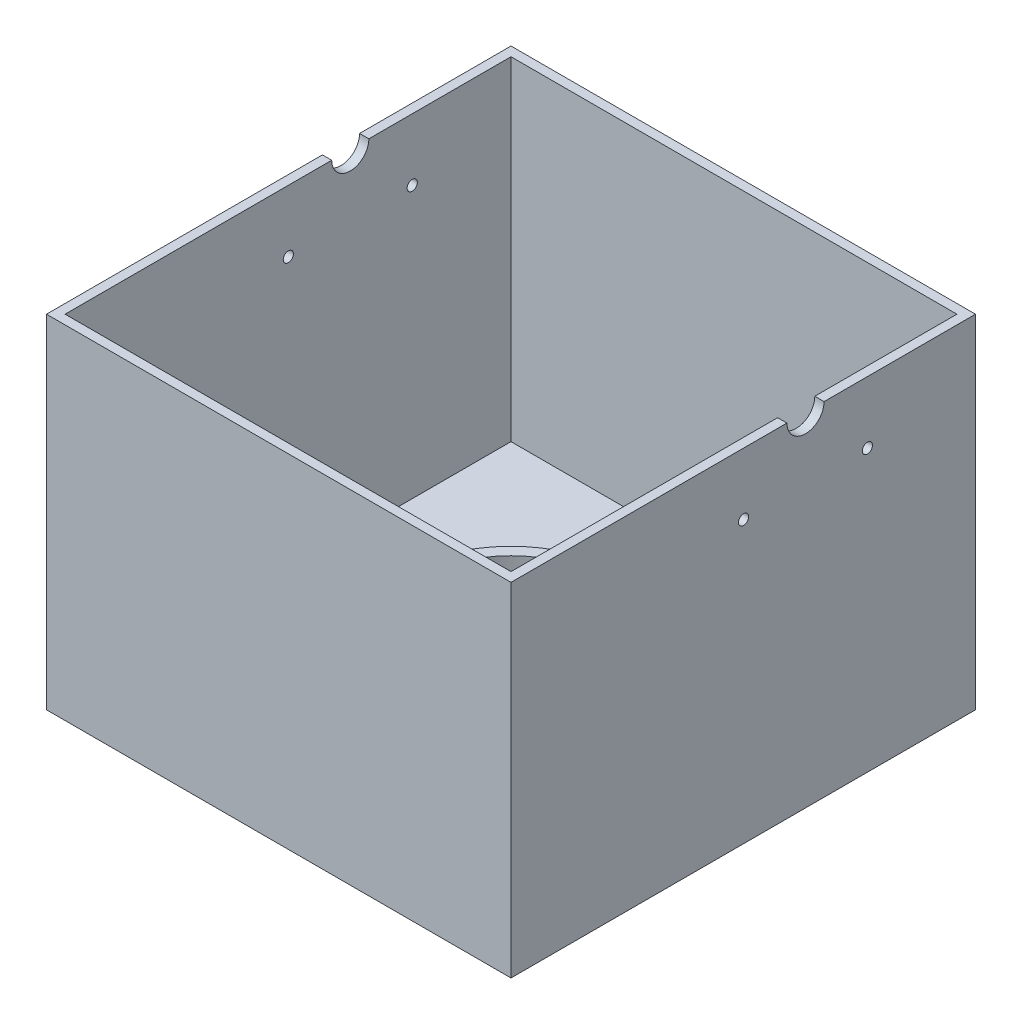
ISO-10303-21;
HEADER;
FILE_DESCRIPTION(('STEP AP214'),'2;1');
FILE_NAME('part.step','',(''),(''),'','','');
FILE_SCHEMA(('AUTOMOTIVE_DESIGN { 1 0 10303 214 1 1 1 1 }'));
ENDSEC;
DATA;
#1=APPLICATION_CONTEXT('core data for automotive mechanical design processes');
#2=APPLICATION_PROTOCOL_DEFINITION('international standard','automotive_design',2000,#1);
#3=PRODUCT_CONTEXT('',#1,'mechanical');
#4=PRODUCT('Part','Part','',(#3));
#5=PRODUCT_RELATED_PRODUCT_CATEGORY('part','',(#4));
#6=PRODUCT_DEFINITION_FORMATION('','',#4);
#7=PRODUCT_DEFINITION_CONTEXT('part definition',#1,'design');
#8=PRODUCT_DEFINITION('design','',#6,#7);
#9=PRODUCT_DEFINITION_SHAPE('','',#8);
#10=(LENGTH_UNIT() NAMED_UNIT(*) SI_UNIT(.MILLI.,.METRE.));
#11=(NAMED_UNIT(*) PLANE_ANGLE_UNIT() SI_UNIT($,.RADIAN.));
#12=(NAMED_UNIT(*) SI_UNIT($,.STERADIAN.) SOLID_ANGLE_UNIT());
#13=UNCERTAINTY_MEASURE_WITH_UNIT(LENGTH_MEASURE(1.E-05),#10,'distance_accuracy_value','');
#14=(GEOMETRIC_REPRESENTATION_CONTEXT(3) GLOBAL_UNCERTAINTY_ASSIGNED_CONTEXT((#13)) GLOBAL_UNIT_ASSIGNED_CONTEXT((#10,
#11,#12)) REPRESENTATION_CONTEXT('',''));
#15=CARTESIAN_POINT('',(0.,0.,0.));
#16=DIRECTION('',(0.,0.,1.));
#17=DIRECTION('',(1.,0.,0.));
#18=AXIS2_PLACEMENT_3D('',#15,#16,#17);
#19=CARTESIAN_POINT('',(0.,91.,0.));
#20=DIRECTION('',(0.,-1.,0.));
#21=DIRECTION('',(0.,0.,-1.));
#22=AXIS2_PLACEMENT_3D('',#19,#20,#21);
#23=CYLINDRICAL_SURFACE('',#22,31.25);
#24=CARTESIAN_POINT('',(0.,21.,0.));
#25=DIRECTION('',(0.,1.,0.));
#26=DIRECTION('',(0.,0.,1.));
#27=AXIS2_PLACEMENT_3D('',#24,#25,#26);
#28=CIRCLE('',#27,31.25);
#29=CARTESIAN_POINT('',(0.,21.,31.25));
#30=VERTEX_POINT('',#29);
#31=EDGE_CURVE('E246',#30,#30,#28,.T.);
#32=ORIENTED_EDGE('',*,*,#31,.T.);
#33=EDGE_LOOP('',(#32));
#34=FACE_BOUND('',#33,.T.);
#35=CARTESIAN_POINT('',(0.,-24.,0.));
#36=DIRECTION('',(0.,-1.,0.));
#37=DIRECTION('',(0.,0.,-1.));
#38=AXIS2_PLACEMENT_3D('',#35,#36,#37);
#39=CIRCLE('',#38,31.25);
#40=CARTESIAN_POINT('',(0.,-24.,-31.25));
#41=VERTEX_POINT('',#40);
#42=EDGE_CURVE('E11',#41,#41,#39,.F.);
#43=ORIENTED_EDGE('',*,*,#42,.F.);
#44=EDGE_LOOP('',(#43));
#45=FACE_BOUND('',#44,.T.);
#46=ADVANCED_FACE('F36',(#34,#45),#23,.F.);
#47=CARTESIAN_POINT('',(0.,0.,0.));
#48=DIRECTION('',(0.,1.,0.));
#49=DIRECTION('',(0.,0.,1.));
#50=AXIS2_PLACEMENT_3D('',#47,#48,#49);
#51=PLANE('',#50);
#52=DIRECTION('',(0.,0.,-1.));
#53=VECTOR('',#52,1.);
#54=CARTESIAN_POINT('',(75.,0.,-75.));
#55=LINE('',#54,#53);
#56=CARTESIAN_POINT('',(75.,0.,75.));
#57=VERTEX_POINT('',#56);
#58=CARTESIAN_POINT('',(75.,0.,-75.));
#59=VERTEX_POINT('',#58);
#60=EDGE_CURVE('E149',#57,#59,#55,.T.);
#61=ORIENTED_EDGE('',*,*,#60,.F.);
#62=DIRECTION('',(1.,0.,0.));
#63=VECTOR('',#62,1.);
#64=CARTESIAN_POINT('',(-75.,0.,75.));
#65=LINE('',#64,#63);
#66=CARTESIAN_POINT('',(-75.,0.,75.));
#67=VERTEX_POINT('',#66);
#68=EDGE_CURVE('E160',#67,#57,#65,.T.);
#69=ORIENTED_EDGE('',*,*,#68,.F.);
#70=DIRECTION('',(0.,0.,1.));
#71=VECTOR('',#70,1.);
#72=CARTESIAN_POINT('',(-75.,0.,-75.));
#73=LINE('',#72,#71);
#74=CARTESIAN_POINT('',(-75.,0.,-75.));
#75=VERTEX_POINT('',#74);
#76=EDGE_CURVE('E158',#75,#67,#73,.T.);
#77=ORIENTED_EDGE('',*,*,#76,.F.);
#78=DIRECTION('',(-1.,0.,0.));
#79=VECTOR('',#78,1.);
#80=CARTESIAN_POINT('',(-75.,0.,-75.));
#81=LINE('',#80,#79);
#82=EDGE_CURVE('E156',#59,#75,#81,.T.);
#83=ORIENTED_EDGE('',*,*,#82,.F.);
#84=EDGE_LOOP('',(#61,#69,#77,#83));
#85=FACE_BOUND('',#84,.T.);
#86=CARTESIAN_POINT('',(0.,0.,0.));
#87=DIRECTION('',(0.,1.,0.));
#88=DIRECTION('',(0.,0.,1.));
#89=AXIS2_PLACEMENT_3D('',#86,#87,#88);
#90=CIRCLE('',#89,35.);
#91=CARTESIAN_POINT('',(0.,0.,35.));
#92=VERTEX_POINT('',#91);
#93=EDGE_CURVE('E44',#92,#92,#90,.F.);
#94=ORIENTED_EDGE('',*,*,#93,.F.);
#95=EDGE_LOOP('',(#94));
#96=FACE_BOUND('',#95,.T.);
#97=ADVANCED_FACE('F187',(#85,#96),#51,.F.);
#98=CARTESIAN_POINT('',(0.,3.,0.));
#99=DIRECTION('',(0.,1.,0.));
#100=DIRECTION('',(0.,0.,1.));
#101=AXIS2_PLACEMENT_3D('',#98,#99,#100);
#102=PLANE('',#101);
#103=DIRECTION('',(0.,0.,1.));
#104=VECTOR('',#103,1.);
#105=CARTESIAN_POINT('',(-72.,3.,72.));
#106=LINE('',#105,#104);
#107=CARTESIAN_POINT('',(-72.,3.,-72.));
#108=VERTEX_POINT('',#107);
#109=CARTESIAN_POINT('',(-72.,3.,72.));
#110=VERTEX_POINT('',#109);
#111=EDGE_CURVE('E237',#108,#110,#106,.T.);
#112=ORIENTED_EDGE('',*,*,#111,.T.);
#113=DIRECTION('',(1.,0.,0.));
#114=VECTOR('',#113,1.);
#115=CARTESIAN_POINT('',(72.,3.,72.));
#116=LINE('',#115,#114);
#117=CARTESIAN_POINT('',(72.,3.,72.));
#118=VERTEX_POINT('',#117);
#119=EDGE_CURVE('E238',#110,#118,#116,.T.);
#120=ORIENTED_EDGE('',*,*,#119,.T.);
#121=DIRECTION('',(0.,0.,-1.));
#122=VECTOR('',#121,1.);
#123=CARTESIAN_POINT('',(72.,3.,72.));
#124=LINE('',#123,#122);
#125=CARTESIAN_POINT('',(72.,3.,-72.));
#126=VERTEX_POINT('',#125);
#127=EDGE_CURVE('E467',#118,#126,#124,.T.);
#128=ORIENTED_EDGE('',*,*,#127,.T.);
#129=DIRECTION('',(-1.,0.,0.));
#130=VECTOR('',#129,1.);
#131=CARTESIAN_POINT('',(72.,3.,-72.));
#132=LINE('',#131,#130);
#133=EDGE_CURVE('E465',#126,#108,#132,.T.);
#134=ORIENTED_EDGE('',*,*,#133,.T.);
#135=EDGE_LOOP('',(#112,#120,#128,#134));
#136=FACE_BOUND('',#135,.T.);
#137=CARTESIAN_POINT('',(0.,3.,0.));
#138=DIRECTION('',(0.,1.,0.));
#139=DIRECTION('',(0.,0.,1.));
#140=AXIS2_PLACEMENT_3D('',#137,#138,#139);
#141=CIRCLE('',#140,35.);
#142=CARTESIAN_POINT('',(0.,3.,35.));
#143=VERTEX_POINT('',#142);
#144=EDGE_CURVE('E243',#143,#143,#141,.T.);
#145=ORIENTED_EDGE('',*,*,#144,.F.);
#146=EDGE_LOOP('',(#145));
#147=FACE_BOUND('',#146,.T.);
#148=ADVANCED_FACE('F189',(#136,#147),#102,.T.);
#149=CARTESIAN_POINT('',(0.,110.65,0.));
#150=DIRECTION('',(0.,1.,0.));
#151=DIRECTION('',(0.,0.,1.));
#152=AXIS2_PLACEMENT_3D('',#149,#150,#151);
#153=PLANE('',#152);
#154=DIRECTION('',(-1.,0.,0.));
#155=VECTOR('',#154,1.);
#156=CARTESIAN_POINT('',(75.,110.65,-26.1));
#157=LINE('',#156,#155);
#158=CARTESIAN_POINT('',(75.,110.65,-26.1));
#159=VERTEX_POINT('',#158);
#160=CARTESIAN_POINT('',(72.,110.65,-26.1));
#161=VERTEX_POINT('',#160);
#162=EDGE_CURVE('E59',#159,#161,#157,.T.);
#163=ORIENTED_EDGE('',*,*,#162,.F.);
#164=DIRECTION('',(0.,0.,-1.));
#165=VECTOR('',#164,1.);
#166=CARTESIAN_POINT('',(75.,110.65,75.));
#167=LINE('',#166,#165);
#168=CARTESIAN_POINT('',(75.,110.65,-75.));
#169=VERTEX_POINT('',#168);
#170=EDGE_CURVE('E139',#159,#169,#167,.T.);
#171=ORIENTED_EDGE('',*,*,#170,.T.);
#172=DIRECTION('',(-1.,0.,0.));
#173=VECTOR('',#172,1.);
#174=CARTESIAN_POINT('',(75.,110.65,-75.));
#175=LINE('',#174,#173);
#176=CARTESIAN_POINT('',(-75.,110.65,-75.));
#177=VERTEX_POINT('',#176);
#178=EDGE_CURVE('E146',#169,#177,#175,.T.);
#179=ORIENTED_EDGE('',*,*,#178,.T.);
#180=DIRECTION('',(0.,0.,1.));
#181=VECTOR('',#180,1.);
#182=CARTESIAN_POINT('',(-75.,110.65,75.));
#183=LINE('',#182,#181);
#184=CARTESIAN_POINT('',(-75.,110.65,-26.1));
#185=VERTEX_POINT('',#184);
#186=EDGE_CURVE('E226',#177,#185,#183,.T.);
#187=ORIENTED_EDGE('',*,*,#186,.T.);
#188=CARTESIAN_POINT('',(-72.,110.65,-26.1));
#189=VERTEX_POINT('',#188);
#190=EDGE_CURVE('E235',#189,#185,#157,.T.);
#191=ORIENTED_EDGE('',*,*,#190,.F.);
#192=DIRECTION('',(0.,0.,1.));
#193=VECTOR('',#192,1.);
#194=CARTESIAN_POINT('',(-72.,110.65,72.));
#195=LINE('',#194,#193);
#196=CARTESIAN_POINT('',(-72.,110.65,-72.));
#197=VERTEX_POINT('',#196);
#198=EDGE_CURVE('E462',#197,#189,#195,.T.);
#199=ORIENTED_EDGE('',*,*,#198,.F.);
#200=DIRECTION('',(-1.,0.,0.));
#201=VECTOR('',#200,1.);
#202=CARTESIAN_POINT('',(72.,110.65,-72.));
#203=LINE('',#202,#201);
#204=CARTESIAN_POINT('',(72.,110.65,-72.));
#205=VERTEX_POINT('',#204);
#206=EDGE_CURVE('E473',#205,#197,#203,.T.);
#207=ORIENTED_EDGE('',*,*,#206,.F.);
#208=DIRECTION('',(0.,0.,-1.));
#209=VECTOR('',#208,1.);
#210=CARTESIAN_POINT('',(72.,110.65,72.));
#211=LINE('',#210,#209);
#212=EDGE_CURVE('E232',#161,#205,#211,.T.);
#213=ORIENTED_EDGE('',*,*,#212,.F.);
#214=EDGE_LOOP('',(#163,#171,#179,#187,#191,#199,#207,#213));
#215=FACE_BOUND('',#214,.T.);
#216=ADVANCED_FACE('F196',(#215),#153,.T.);
#217=CARTESIAN_POINT('',(75.,3.,-75.));
#218=DIRECTION('',(-1.,0.,0.));
#219=DIRECTION('',(0.,0.,1.));
#220=AXIS2_PLACEMENT_3D('',#217,#218,#219);
#221=PLANE('',#220);
#222=CARTESIAN_POINT('',(75.,90.65,-40.1));
#223=DIRECTION('',(-1.,0.,0.));
#224=DIRECTION('',(0.,0.,1.));
#225=AXIS2_PLACEMENT_3D('',#222,#223,#224);
#226=CIRCLE('',#225,1.65);
#227=CARTESIAN_POINT('',(75.,90.65,-38.45));
#228=VERTEX_POINT('',#227);
#229=EDGE_CURVE('E178',#228,#228,#226,.T.);
#230=ORIENTED_EDGE('',*,*,#229,.T.);
#231=EDGE_LOOP('',(#230));
#232=FACE_BOUND('',#231,.T.);
#233=CARTESIAN_POINT('',(75.,90.65,-0.10000000000001));
#234=DIRECTION('',(-1.,0.,0.));
#235=DIRECTION('',(0.,0.,1.));
#236=AXIS2_PLACEMENT_3D('',#233,#234,#235);
#237=CIRCLE('',#236,1.65);
#238=CARTESIAN_POINT('',(75.,90.65,1.54999999999999));
#239=VERTEX_POINT('',#238);
#240=EDGE_CURVE('E258',#239,#239,#237,.T.);
#241=ORIENTED_EDGE('',*,*,#240,.T.);
#242=EDGE_LOOP('',(#241));
#243=FACE_BOUND('',#242,.T.);
#244=ORIENTED_EDGE('',*,*,#170,.F.);
#245=CARTESIAN_POINT('',(75.,110.65,-20.1));
#246=DIRECTION('',(-1.,0.,0.));
#247=DIRECTION('',(0.,0.,1.));
#248=AXIS2_PLACEMENT_3D('',#245,#246,#247);
#249=CIRCLE('',#248,6.);
#250=CARTESIAN_POINT('',(75.,110.65,-14.1));
#251=VERTEX_POINT('',#250);
#252=EDGE_CURVE('E126',#159,#251,#249,.T.);
#253=ORIENTED_EDGE('',*,*,#252,.T.);
#254=CARTESIAN_POINT('',(75.,110.65,75.));
#255=VERTEX_POINT('',#254);
#256=EDGE_CURVE('E137',#255,#251,#167,.T.);
#257=ORIENTED_EDGE('',*,*,#256,.F.);
#258=DIRECTION('',(0.,-1.,0.));
#259=VECTOR('',#258,1.);
#260=CARTESIAN_POINT('',(75.,3.,75.));
#261=LINE('',#260,#259);
#262=EDGE_CURVE('E162',#255,#57,#261,.T.);
#263=ORIENTED_EDGE('',*,*,#262,.T.);
#264=ORIENTED_EDGE('',*,*,#60,.T.);
#265=DIRECTION('',(0.,-1.,0.));
#266=VECTOR('',#265,1.);
#267=CARTESIAN_POINT('',(75.,3.,-75.));
#268=LINE('',#267,#266);
#269=EDGE_CURVE('E170',#169,#59,#268,.T.);
#270=ORIENTED_EDGE('',*,*,#269,.F.);
#271=EDGE_LOOP('',(#244,#253,#257,#263,#264,#270));
#272=FACE_BOUND('',#271,.T.);
#273=ADVANCED_FACE('F38',(#232,#243,#272),#221,.F.);
#274=CARTESIAN_POINT('',(-75.,3.,-75.));
#275=DIRECTION('',(0.,0.,1.));
#276=DIRECTION('',(1.,0.,0.));
#277=AXIS2_PLACEMENT_3D('',#274,#275,#276);
#278=PLANE('',#277);
#279=ORIENTED_EDGE('',*,*,#82,.T.);
#280=DIRECTION('',(0.,-1.,0.));
#281=VECTOR('',#280,1.);
#282=CARTESIAN_POINT('',(-75.,3.,-75.));
#283=LINE('',#282,#281);
#284=EDGE_CURVE('E167',#177,#75,#283,.T.);
#285=ORIENTED_EDGE('',*,*,#284,.F.);
#286=ORIENTED_EDGE('',*,*,#178,.F.);
#287=ORIENTED_EDGE('',*,*,#269,.T.);
#288=EDGE_LOOP('',(#279,#285,#286,#287));
#289=FACE_BOUND('',#288,.T.);
#290=ADVANCED_FACE('F210',(#289),#278,.F.);
#291=CARTESIAN_POINT('',(-75.,3.,-75.));
#292=DIRECTION('',(1.,0.,0.));
#293=DIRECTION('',(0.,0.,-1.));
#294=AXIS2_PLACEMENT_3D('',#291,#292,#293);
#295=PLANE('',#294);
#296=CARTESIAN_POINT('',(-75.,90.65,-40.1));
#297=DIRECTION('',(-1.,0.,0.));
#298=DIRECTION('',(0.,0.,1.));
#299=AXIS2_PLACEMENT_3D('',#296,#297,#298);
#300=CIRCLE('',#299,1.65);
#301=CARTESIAN_POINT('',(-75.,90.65,-38.45));
#302=VERTEX_POINT('',#301);
#303=EDGE_CURVE('E262',#302,#302,#300,.T.);
#304=ORIENTED_EDGE('',*,*,#303,.F.);
#305=EDGE_LOOP('',(#304));
#306=FACE_BOUND('',#305,.T.);
#307=CARTESIAN_POINT('',(-75.,90.65,-0.099999999999982));
#308=DIRECTION('',(-1.,0.,0.));
#309=DIRECTION('',(0.,0.,1.));
#310=AXIS2_PLACEMENT_3D('',#307,#308,#309);
#311=CIRCLE('',#310,1.65);
#312=CARTESIAN_POINT('',(-75.,90.65,1.55000000000002));
#313=VERTEX_POINT('',#312);
#314=EDGE_CURVE('E255',#313,#313,#311,.T.);
#315=ORIENTED_EDGE('',*,*,#314,.F.);
#316=EDGE_LOOP('',(#315));
#317=FACE_BOUND('',#316,.T.);
#318=CARTESIAN_POINT('',(-75.,110.65,-14.1));
#319=VERTEX_POINT('',#318);
#320=CARTESIAN_POINT('',(-75.,110.65,75.));
#321=VERTEX_POINT('',#320);
#322=EDGE_CURVE('E487',#319,#321,#183,.T.);
#323=ORIENTED_EDGE('',*,*,#322,.F.);
#324=CARTESIAN_POINT('',(-75.,110.65,-20.1));
#325=DIRECTION('',(-1.,0.,0.));
#326=DIRECTION('',(0.,0.,1.));
#327=AXIS2_PLACEMENT_3D('',#324,#325,#326);
#328=CIRCLE('',#327,6.);
#329=EDGE_CURVE('E140',#185,#319,#328,.T.);
#330=ORIENTED_EDGE('',*,*,#329,.F.);
#331=ORIENTED_EDGE('',*,*,#186,.F.);
#332=ORIENTED_EDGE('',*,*,#284,.T.);
#333=ORIENTED_EDGE('',*,*,#76,.T.);
#334=DIRECTION('',(0.,-1.,0.));
#335=VECTOR('',#334,1.);
#336=CARTESIAN_POINT('',(-75.,3.,75.));
#337=LINE('',#336,#335);
#338=EDGE_CURVE('E164',#321,#67,#337,.T.);
#339=ORIENTED_EDGE('',*,*,#338,.F.);
#340=EDGE_LOOP('',(#323,#330,#331,#332,#333,#339));
#341=FACE_BOUND('',#340,.T.);
#342=ADVANCED_FACE('F207',(#306,#317,#341),#295,.F.);
#343=CARTESIAN_POINT('',(-75.,3.,75.));
#344=DIRECTION('',(0.,0.,-1.));
#345=DIRECTION('',(-1.,0.,0.));
#346=AXIS2_PLACEMENT_3D('',#343,#344,#345);
#347=PLANE('',#346);
#348=ORIENTED_EDGE('',*,*,#68,.T.);
#349=ORIENTED_EDGE('',*,*,#262,.F.);
#350=DIRECTION('',(1.,0.,0.));
#351=VECTOR('',#350,1.);
#352=CARTESIAN_POINT('',(75.,110.65,75.));
#353=LINE('',#352,#351);
#354=EDGE_CURVE('E145',#321,#255,#353,.T.);
#355=ORIENTED_EDGE('',*,*,#354,.F.);
#356=ORIENTED_EDGE('',*,*,#338,.T.);
#357=EDGE_LOOP('',(#348,#349,#355,#356));
#358=FACE_BOUND('',#357,.T.);
#359=ADVANCED_FACE('F204',(#358),#347,.F.);
#360=DIRECTION('',(-1.,0.,0.));
#361=VECTOR('',#360,1.);
#362=CARTESIAN_POINT('',(75.,110.65,-14.1));
#363=LINE('',#362,#361);
#364=CARTESIAN_POINT('',(-72.,110.65,-14.1));
#365=VERTEX_POINT('',#364);
#366=EDGE_CURVE('E51',#319,#365,#363,.F.);
#367=ORIENTED_EDGE('',*,*,#366,.F.);
#368=ORIENTED_EDGE('',*,*,#322,.T.);
#369=ORIENTED_EDGE('',*,*,#354,.T.);
#370=ORIENTED_EDGE('',*,*,#256,.T.);
#371=CARTESIAN_POINT('',(72.,110.65,-14.1));
#372=VERTEX_POINT('',#371);
#373=EDGE_CURVE('E123',#372,#251,#363,.F.);
#374=ORIENTED_EDGE('',*,*,#373,.F.);
#375=CARTESIAN_POINT('',(72.,110.65,72.));
#376=VERTEX_POINT('',#375);
#377=EDGE_CURVE('E471',#376,#372,#211,.T.);
#378=ORIENTED_EDGE('',*,*,#377,.F.);
#379=DIRECTION('',(1.,0.,0.));
#380=VECTOR('',#379,1.);
#381=CARTESIAN_POINT('',(72.,110.65,72.));
#382=LINE('',#381,#380);
#383=CARTESIAN_POINT('',(-72.,110.65,72.));
#384=VERTEX_POINT('',#383);
#385=EDGE_CURVE('E464',#384,#376,#382,.T.);
#386=ORIENTED_EDGE('',*,*,#385,.F.);
#387=EDGE_CURVE('E458',#365,#384,#195,.T.);
#388=ORIENTED_EDGE('',*,*,#387,.F.);
#389=EDGE_LOOP('',(#367,#368,#369,#370,#374,#378,#386,#388));
#390=FACE_BOUND('',#389,.T.);
#391=ADVANCED_FACE('F143',(#390),#153,.T.);
#392=CARTESIAN_POINT('',(-72.,110.65,72.));
#393=DIRECTION('',(1.,0.,0.));
#394=DIRECTION('',(0.,0.,-1.));
#395=AXIS2_PLACEMENT_3D('',#392,#393,#394);
#396=PLANE('',#395);
#397=CARTESIAN_POINT('',(-72.,90.65,-40.1));
#398=DIRECTION('',(1.,0.,0.));
#399=DIRECTION('',(0.,0.,-1.));
#400=AXIS2_PLACEMENT_3D('',#397,#398,#399);
#401=CIRCLE('',#400,1.65);
#402=CARTESIAN_POINT('',(-72.,90.65,-41.75));
#403=VERTEX_POINT('',#402);
#404=EDGE_CURVE('E181',#403,#403,#401,.T.);
#405=ORIENTED_EDGE('',*,*,#404,.F.);
#406=EDGE_LOOP('',(#405));
#407=FACE_BOUND('',#406,.T.);
#408=CARTESIAN_POINT('',(-72.,90.65,-0.0999999999999826));
#409=DIRECTION('',(1.,0.,0.));
#410=DIRECTION('',(0.,0.,-1.));
#411=AXIS2_PLACEMENT_3D('',#408,#409,#410);
#412=CIRCLE('',#411,1.65);
#413=CARTESIAN_POINT('',(-72.,90.65,-1.74999999999998));
#414=VERTEX_POINT('',#413);
#415=EDGE_CURVE('E177',#414,#414,#412,.T.);
#416=ORIENTED_EDGE('',*,*,#415,.F.);
#417=EDGE_LOOP('',(#416));
#418=FACE_BOUND('',#417,.T.);
#419=CARTESIAN_POINT('',(-72.,110.65,-20.1));
#420=DIRECTION('',(1.,0.,0.));
#421=DIRECTION('',(0.,0.,-1.));
#422=AXIS2_PLACEMENT_3D('',#419,#420,#421);
#423=CIRCLE('',#422,6.);
#424=EDGE_CURVE('E233',#365,#189,#423,.T.);
#425=ORIENTED_EDGE('',*,*,#424,.F.);
#426=ORIENTED_EDGE('',*,*,#387,.T.);
#427=DIRECTION('',(0.,-1.,0.));
#428=VECTOR('',#427,1.);
#429=CARTESIAN_POINT('',(-72.,110.65,72.));
#430=LINE('',#429,#428);
#431=EDGE_CURVE('E486',#384,#110,#430,.T.);
#432=ORIENTED_EDGE('',*,*,#431,.T.);
#433=ORIENTED_EDGE('',*,*,#111,.F.);
#434=DIRECTION('',(0.,-1.,0.));
#435=VECTOR('',#434,1.);
#436=CARTESIAN_POINT('',(-72.,110.65,-72.));
#437=LINE('',#436,#435);
#438=EDGE_CURVE('E474',#197,#108,#437,.T.);
#439=ORIENTED_EDGE('',*,*,#438,.F.);
#440=ORIENTED_EDGE('',*,*,#198,.T.);
#441=EDGE_LOOP('',(#425,#426,#432,#433,#439,#440));
#442=FACE_BOUND('',#441,.T.);
#443=ADVANCED_FACE('F330',(#407,#418,#442),#396,.T.);
#444=CARTESIAN_POINT('',(72.,110.65,72.));
#445=DIRECTION('',(0.,0.,-1.));
#446=DIRECTION('',(-1.,0.,0.));
#447=AXIS2_PLACEMENT_3D('',#444,#445,#446);
#448=PLANE('',#447);
#449=ORIENTED_EDGE('',*,*,#119,.F.);
#450=ORIENTED_EDGE('',*,*,#431,.F.);
#451=ORIENTED_EDGE('',*,*,#385,.T.);
#452=DIRECTION('',(0.,-1.,0.));
#453=VECTOR('',#452,1.);
#454=CARTESIAN_POINT('',(72.,110.65,72.));
#455=LINE('',#454,#453);
#456=EDGE_CURVE('E483',#376,#118,#455,.T.);
#457=ORIENTED_EDGE('',*,*,#456,.T.);
#458=EDGE_LOOP('',(#449,#450,#451,#457));
#459=FACE_BOUND('',#458,.T.);
#460=ADVANCED_FACE('F326',(#459),#448,.T.);
#461=CARTESIAN_POINT('',(72.,110.65,72.));
#462=DIRECTION('',(-1.,0.,0.));
#463=DIRECTION('',(0.,0.,1.));
#464=AXIS2_PLACEMENT_3D('',#461,#462,#463);
#465=PLANE('',#464);
#466=CARTESIAN_POINT('',(72.,90.65,-40.1));
#467=DIRECTION('',(-1.,0.,0.));
#468=DIRECTION('',(0.,0.,1.));
#469=AXIS2_PLACEMENT_3D('',#466,#467,#468);
#470=CIRCLE('',#469,1.65);
#471=CARTESIAN_POINT('',(72.,90.65,-38.45));
#472=VERTEX_POINT('',#471);
#473=EDGE_CURVE('E179',#472,#472,#470,.T.);
#474=ORIENTED_EDGE('',*,*,#473,.F.);
#475=EDGE_LOOP('',(#474));
#476=FACE_BOUND('',#475,.T.);
#477=CARTESIAN_POINT('',(72.,90.65,-0.100000000000009));
#478=DIRECTION('',(-1.,0.,0.));
#479=DIRECTION('',(0.,0.,1.));
#480=AXIS2_PLACEMENT_3D('',#477,#478,#479);
#481=CIRCLE('',#480,1.65);
#482=CARTESIAN_POINT('',(72.,90.65,1.54999999999999));
#483=VERTEX_POINT('',#482);
#484=EDGE_CURVE('E174',#483,#483,#481,.T.);
#485=ORIENTED_EDGE('',*,*,#484,.F.);
#486=EDGE_LOOP('',(#485));
#487=FACE_BOUND('',#486,.T.);
#488=CARTESIAN_POINT('',(72.,110.65,-20.1));
#489=DIRECTION('',(-1.,0.,0.));
#490=DIRECTION('',(0.,0.,1.));
#491=AXIS2_PLACEMENT_3D('',#488,#489,#490);
#492=CIRCLE('',#491,6.);
#493=EDGE_CURVE('E127',#161,#372,#492,.T.);
#494=ORIENTED_EDGE('',*,*,#493,.F.);
#495=ORIENTED_EDGE('',*,*,#212,.T.);
#496=DIRECTION('',(0.,-1.,0.));
#497=VECTOR('',#496,1.);
#498=CARTESIAN_POINT('',(72.,110.65,-72.));
#499=LINE('',#498,#497);
#500=EDGE_CURVE('E480',#205,#126,#499,.T.);
#501=ORIENTED_EDGE('',*,*,#500,.T.);
#502=ORIENTED_EDGE('',*,*,#127,.F.);
#503=ORIENTED_EDGE('',*,*,#456,.F.);
#504=ORIENTED_EDGE('',*,*,#377,.T.);
#505=EDGE_LOOP('',(#494,#495,#501,#502,#503,#504));
#506=FACE_BOUND('',#505,.T.);
#507=ADVANCED_FACE('F322',(#476,#487,#506),#465,.T.);
#508=CARTESIAN_POINT('',(72.,110.65,-72.));
#509=DIRECTION('',(0.,0.,1.));
#510=DIRECTION('',(1.,0.,0.));
#511=AXIS2_PLACEMENT_3D('',#508,#509,#510);
#512=PLANE('',#511);
#513=ORIENTED_EDGE('',*,*,#133,.F.);
#514=ORIENTED_EDGE('',*,*,#500,.F.);
#515=ORIENTED_EDGE('',*,*,#206,.T.);
#516=ORIENTED_EDGE('',*,*,#438,.T.);
#517=EDGE_LOOP('',(#513,#514,#515,#516));
#518=FACE_BOUND('',#517,.T.);
#519=ADVANCED_FACE('F318',(#518),#512,.T.);
#520=CARTESIAN_POINT('',(75.,110.65,-20.1));
#521=DIRECTION('',(-1.,0.,0.));
#522=DIRECTION('',(0.,0.,1.));
#523=AXIS2_PLACEMENT_3D('',#520,#521,#522);
#524=CYLINDRICAL_SURFACE('',#523,6.);
#525=ORIENTED_EDGE('',*,*,#162,.T.);
#526=ORIENTED_EDGE('',*,*,#493,.T.);
#527=ORIENTED_EDGE('',*,*,#373,.T.);
#528=ORIENTED_EDGE('',*,*,#252,.F.);
#529=EDGE_LOOP('',(#525,#526,#527,#528));
#530=FACE_BOUND('',#529,.T.);
#531=ADVANCED_FACE('F125',(#530),#524,.F.);
#532=ORIENTED_EDGE('',*,*,#190,.T.);
#533=ORIENTED_EDGE('',*,*,#329,.T.);
#534=ORIENTED_EDGE('',*,*,#366,.T.);
#535=ORIENTED_EDGE('',*,*,#424,.T.);
#536=EDGE_LOOP('',(#532,#533,#534,#535));
#537=FACE_BOUND('',#536,.T.);
#538=ADVANCED_FACE('F312',(#537),#524,.F.);
#539=CARTESIAN_POINT('',(0.,21.,0.));
#540=DIRECTION('',(0.,1.,0.));
#541=DIRECTION('',(0.,0.,1.));
#542=AXIS2_PLACEMENT_3D('',#539,#540,#541);
#543=PLANE('',#542);
#544=CARTESIAN_POINT('',(0.,21.,0.));
#545=DIRECTION('',(0.,1.,0.));
#546=DIRECTION('',(0.,0.,1.));
#547=AXIS2_PLACEMENT_3D('',#544,#545,#546);
#548=CIRCLE('',#547,35.);
#549=CARTESIAN_POINT('',(0.,21.,35.));
#550=VERTEX_POINT('',#549);
#551=EDGE_CURVE('E241',#550,#550,#548,.T.);
#552=ORIENTED_EDGE('',*,*,#551,.T.);
#553=EDGE_LOOP('',(#552));
#554=FACE_BOUND('',#553,.T.);
#555=ORIENTED_EDGE('',*,*,#31,.F.);
#556=EDGE_LOOP('',(#555));
#557=FACE_BOUND('',#556,.T.);
#558=ADVANCED_FACE('F309',(#554,#557),#543,.T.);
#559=CARTESIAN_POINT('',(0.,21.,0.));
#560=DIRECTION('',(0.,-1.,0.));
#561=DIRECTION('',(0.,0.,-1.));
#562=AXIS2_PLACEMENT_3D('',#559,#560,#561);
#563=CYLINDRICAL_SURFACE('',#562,35.);
#564=ORIENTED_EDGE('',*,*,#551,.F.);
#565=EDGE_LOOP('',(#564));
#566=FACE_BOUND('',#565,.T.);
#567=ORIENTED_EDGE('',*,*,#144,.T.);
#568=EDGE_LOOP('',(#567));
#569=FACE_BOUND('',#568,.T.);
#570=ADVANCED_FACE('F307',(#566,#569),#563,.T.);
#571=CARTESIAN_POINT('',(75.,90.65,-0.10000000000001));
#572=DIRECTION('',(-1.,0.,0.));
#573=DIRECTION('',(0.,0.,1.));
#574=AXIS2_PLACEMENT_3D('',#571,#572,#573);
#575=CYLINDRICAL_SURFACE('',#574,1.65);
#576=ORIENTED_EDGE('',*,*,#484,.T.);
#577=EDGE_LOOP('',(#576));
#578=FACE_BOUND('',#577,.T.);
#579=ORIENTED_EDGE('',*,*,#240,.F.);
#580=EDGE_LOOP('',(#579));
#581=FACE_BOUND('',#580,.T.);
#582=ADVANCED_FACE('F303',(#578,#581),#575,.F.);
#583=CARTESIAN_POINT('',(75.,90.65,-40.1));
#584=DIRECTION('',(-1.,0.,0.));
#585=DIRECTION('',(0.,0.,1.));
#586=AXIS2_PLACEMENT_3D('',#583,#584,#585);
#587=CYLINDRICAL_SURFACE('',#586,1.65);
#588=ORIENTED_EDGE('',*,*,#473,.T.);
#589=EDGE_LOOP('',(#588));
#590=FACE_BOUND('',#589,.T.);
#591=ORIENTED_EDGE('',*,*,#229,.F.);
#592=EDGE_LOOP('',(#591));
#593=FACE_BOUND('',#592,.T.);
#594=ADVANCED_FACE('F299',(#590,#593),#587,.F.);
#595=ORIENTED_EDGE('',*,*,#415,.T.);
#596=EDGE_LOOP('',(#595));
#597=FACE_BOUND('',#596,.T.);
#598=ORIENTED_EDGE('',*,*,#314,.T.);
#599=EDGE_LOOP('',(#598));
#600=FACE_BOUND('',#599,.T.);
#601=ADVANCED_FACE('F296',(#597,#600),#575,.F.);
#602=ORIENTED_EDGE('',*,*,#404,.T.);
#603=EDGE_LOOP('',(#602));
#604=FACE_BOUND('',#603,.T.);
#605=ORIENTED_EDGE('',*,*,#303,.T.);
#606=EDGE_LOOP('',(#605));
#607=FACE_BOUND('',#606,.T.);
#608=ADVANCED_FACE('F287',(#604,#607),#587,.F.);
#609=CARTESIAN_POINT('',(0.,-27.,0.));
#610=DIRECTION('',(0.,-1.,0.));
#611=DIRECTION('',(0.,0.,-1.));
#612=AXIS2_PLACEMENT_3D('',#609,#610,#611);
#613=PLANE('',#612);
#614=CARTESIAN_POINT('',(0.,-27.,0.));
#615=DIRECTION('',(0.,-1.,0.));
#616=DIRECTION('',(0.,0.,-1.));
#617=AXIS2_PLACEMENT_3D('',#614,#615,#616);
#618=CIRCLE('',#617,35.);
#619=CARTESIAN_POINT('',(0.,-27.,-35.));
#620=VERTEX_POINT('',#619);
#621=EDGE_CURVE('E259',#620,#620,#618,.T.);
#622=ORIENTED_EDGE('',*,*,#621,.T.);
#623=EDGE_LOOP('',(#622));
#624=FACE_BOUND('',#623,.T.);
#625=CARTESIAN_POINT('',(0.,-27.,0.));
#626=DIRECTION('',(0.,-1.,0.));
#627=DIRECTION('',(0.,0.,-1.));
#628=AXIS2_PLACEMENT_3D('',#625,#626,#627);
#629=CIRCLE('',#628,27.5);
#630=CARTESIAN_POINT('',(0.,-27.,-27.5));
#631=VERTEX_POINT('',#630);
#632=EDGE_CURVE('E270',#631,#631,#629,.T.);
#633=ORIENTED_EDGE('',*,*,#632,.F.);
#634=EDGE_LOOP('',(#633));
#635=FACE_BOUND('',#634,.T.);
#636=ADVANCED_FACE('F285',(#624,#635),#613,.T.);
#637=CARTESIAN_POINT('',(0.,-27.,0.));
#638=DIRECTION('',(0.,1.,0.));
#639=DIRECTION('',(0.,0.,1.));
#640=AXIS2_PLACEMENT_3D('',#637,#638,#639);
#641=CYLINDRICAL_SURFACE('',#640,35.);
#642=ORIENTED_EDGE('',*,*,#621,.F.);
#643=EDGE_LOOP('',(#642));
#644=FACE_BOUND('',#643,.T.);
#645=ORIENTED_EDGE('',*,*,#93,.T.);
#646=EDGE_LOOP('',(#645));
#647=FACE_BOUND('',#646,.T.);
#648=ADVANCED_FACE('F185',(#644,#647),#641,.T.);
#649=CARTESIAN_POINT('',(0.,-24.,0.));
#650=DIRECTION('',(0.,-1.,0.));
#651=DIRECTION('',(0.,0.,-1.));
#652=AXIS2_PLACEMENT_3D('',#649,#650,#651);
#653=PLANE('',#652);
#654=CARTESIAN_POINT('',(0.,-24.,0.));
#655=DIRECTION('',(0.,-1.,0.));
#656=DIRECTION('',(0.,0.,-1.));
#657=AXIS2_PLACEMENT_3D('',#654,#655,#656);
#658=CIRCLE('',#657,27.5);
#659=CARTESIAN_POINT('',(0.,-24.,-27.5));
#660=VERTEX_POINT('',#659);
#661=EDGE_CURVE('E269',#660,#660,#658,.T.);
#662=ORIENTED_EDGE('',*,*,#661,.T.);
#663=EDGE_LOOP('',(#662));
#664=FACE_BOUND('',#663,.T.);
#665=ORIENTED_EDGE('',*,*,#42,.T.);
#666=EDGE_LOOP('',(#665));
#667=FACE_BOUND('',#666,.T.);
#668=ADVANCED_FACE('F276',(#664,#667),#653,.F.);
#669=CARTESIAN_POINT('',(0.,-24.,0.));
#670=DIRECTION('',(0.,-1.,0.));
#671=DIRECTION('',(0.,0.,-1.));
#672=AXIS2_PLACEMENT_3D('',#669,#670,#671);
#673=CYLINDRICAL_SURFACE('',#672,27.5);
#674=ORIENTED_EDGE('',*,*,#661,.F.);
#675=EDGE_LOOP('',(#674));
#676=FACE_BOUND('',#675,.T.);
#677=ORIENTED_EDGE('',*,*,#632,.T.);
#678=EDGE_LOOP('',(#677));
#679=FACE_BOUND('',#678,.T.);
#680=ADVANCED_FACE('F279',(#676,#679),#673,.F.);
#681=CLOSED_SHELL('',(#46,#97,#148,#216,#273,#290,#342,#359,#391,#443,#460,#507,#519,#531,#538,
#558,#570,#582,#594,#601,#608,#636,#648,#668,#680));
#682=MANIFOLD_SOLID_BREP('B2',#681);
#683=ADVANCED_BREP_SHAPE_REPRESENTATION('',(#18,#682),#14);
#684=SHAPE_DEFINITION_REPRESENTATION(#9,#683);
ENDSEC;
END-ISO-10303-21;
